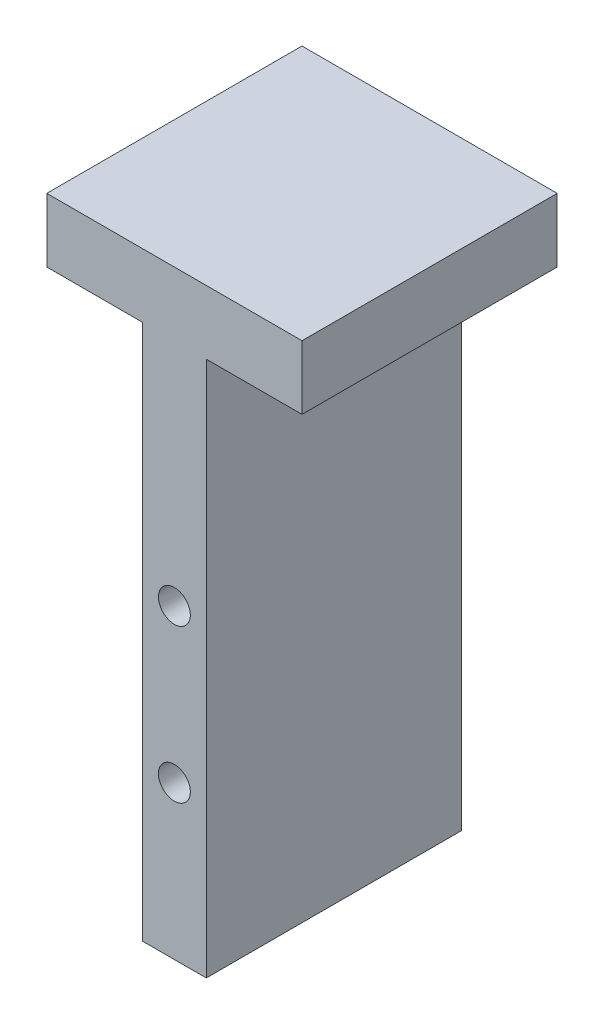
ISO-10303-21;
HEADER;
FILE_DESCRIPTION(('STEP AP214'),'2;1');
FILE_NAME('part.step','',(''),(''),'','','');
FILE_SCHEMA(('AUTOMOTIVE_DESIGN { 1 0 10303 214 1 1 1 1 }'));
ENDSEC;
DATA;
#1=APPLICATION_CONTEXT('core data for automotive mechanical design processes');
#2=APPLICATION_PROTOCOL_DEFINITION('international standard','automotive_design',2000,#1);
#3=PRODUCT_CONTEXT('',#1,'mechanical');
#4=PRODUCT('Part','Part','',(#3));
#5=PRODUCT_RELATED_PRODUCT_CATEGORY('part','',(#4));
#6=PRODUCT_DEFINITION_FORMATION('','',#4);
#7=PRODUCT_DEFINITION_CONTEXT('part definition',#1,'design');
#8=PRODUCT_DEFINITION('design','',#6,#7);
#9=PRODUCT_DEFINITION_SHAPE('','',#8);
#10=(LENGTH_UNIT() NAMED_UNIT(*) SI_UNIT(.MILLI.,.METRE.));
#11=(NAMED_UNIT(*) PLANE_ANGLE_UNIT() SI_UNIT($,.RADIAN.));
#12=(NAMED_UNIT(*) SI_UNIT($,.STERADIAN.) SOLID_ANGLE_UNIT());
#13=UNCERTAINTY_MEASURE_WITH_UNIT(LENGTH_MEASURE(1.E-05),#10,'distance_accuracy_value','');
#14=(GEOMETRIC_REPRESENTATION_CONTEXT(3) GLOBAL_UNCERTAINTY_ASSIGNED_CONTEXT((#13)) GLOBAL_UNIT_ASSIGNED_CONTEXT((#10,
#11,#12)) REPRESENTATION_CONTEXT('',''));
#15=CARTESIAN_POINT('',(0.,0.,0.));
#16=DIRECTION('',(0.,0.,1.));
#17=DIRECTION('',(1.,0.,0.));
#18=AXIS2_PLACEMENT_3D('',#15,#16,#17);
#19=CARTESIAN_POINT('',(0.,0.,0.));
#20=DIRECTION('',(0.,-1.,0.));
#21=DIRECTION('',(0.,0.,-1.));
#22=AXIS2_PLACEMENT_3D('',#19,#20,#21);
#23=PLANE('',#22);
#24=DIRECTION('',(0.,0.,1.));
#25=VECTOR('',#24,1.);
#26=CARTESIAN_POINT('',(2.5,0.,-10.));
#27=LINE('',#26,#25);
#28=CARTESIAN_POINT('',(2.5,0.,-10.));
#29=VERTEX_POINT('',#28);
#30=CARTESIAN_POINT('',(2.5,0.,10.));
#31=VERTEX_POINT('',#30);
#32=EDGE_CURVE('E66',#29,#31,#27,.T.);
#33=ORIENTED_EDGE('',*,*,#32,.F.);
#34=DIRECTION('',(-1.,0.,0.));
#35=VECTOR('',#34,1.);
#36=CARTESIAN_POINT('',(-10.,0.,-10.));
#37=LINE('',#36,#35);
#38=CARTESIAN_POINT('',(10.,0.,-10.));
#39=VERTEX_POINT('',#38);
#40=EDGE_CURVE('E202',#39,#29,#37,.T.);
#41=ORIENTED_EDGE('',*,*,#40,.F.);
#42=DIRECTION('',(0.,0.,-1.));
#43=VECTOR('',#42,1.);
#44=CARTESIAN_POINT('',(10.,0.,10.));
#45=LINE('',#44,#43);
#46=CARTESIAN_POINT('',(10.,0.,10.));
#47=VERTEX_POINT('',#46);
#48=EDGE_CURVE('E133',#47,#39,#45,.T.);
#49=ORIENTED_EDGE('',*,*,#48,.F.);
#50=DIRECTION('',(1.,0.,0.));
#51=VECTOR('',#50,1.);
#52=CARTESIAN_POINT('',(-10.,0.,10.));
#53=LINE('',#52,#51);
#54=EDGE_CURVE('E71',#31,#47,#53,.T.);
#55=ORIENTED_EDGE('',*,*,#54,.F.);
#56=EDGE_LOOP('',(#33,#41,#49,#55));
#57=FACE_BOUND('',#56,.T.);
#58=ADVANCED_FACE('F51',(#57),#23,.T.);
#59=CARTESIAN_POINT('',(10.,5.,10.));
#60=DIRECTION('',(-1.,0.,0.));
#61=DIRECTION('',(0.,0.,1.));
#62=AXIS2_PLACEMENT_3D('',#59,#60,#61);
#63=PLANE('',#62);
#64=ORIENTED_EDGE('',*,*,#48,.T.);
#65=DIRECTION('',(0.,-1.,0.));
#66=VECTOR('',#65,1.);
#67=CARTESIAN_POINT('',(10.,5.,-10.));
#68=LINE('',#67,#66);
#69=CARTESIAN_POINT('',(10.,5.,-10.));
#70=VERTEX_POINT('',#69);
#71=EDGE_CURVE('E13',#70,#39,#68,.T.);
#72=ORIENTED_EDGE('',*,*,#71,.F.);
#73=DIRECTION('',(0.,0.,-1.));
#74=VECTOR('',#73,1.);
#75=CARTESIAN_POINT('',(10.,5.,10.));
#76=LINE('',#75,#74);
#77=CARTESIAN_POINT('',(10.,5.,10.));
#78=VERTEX_POINT('',#77);
#79=EDGE_CURVE('E188',#78,#70,#76,.T.);
#80=ORIENTED_EDGE('',*,*,#79,.F.);
#81=DIRECTION('',(0.,-1.,0.));
#82=VECTOR('',#81,1.);
#83=CARTESIAN_POINT('',(10.,5.,10.));
#84=LINE('',#83,#82);
#85=EDGE_CURVE('E198',#78,#47,#84,.T.);
#86=ORIENTED_EDGE('',*,*,#85,.T.);
#87=EDGE_LOOP('',(#64,#72,#80,#86));
#88=FACE_BOUND('',#87,.T.);
#89=ADVANCED_FACE('F53',(#88),#63,.F.);
#90=CARTESIAN_POINT('',(-10.,5.,-10.));
#91=DIRECTION('',(0.,0.,1.));
#92=DIRECTION('',(1.,0.,0.));
#93=AXIS2_PLACEMENT_3D('',#90,#91,#92);
#94=PLANE('',#93);
#95=CARTESIAN_POINT('',(0.,-18.,-10.));
#96=DIRECTION('',(0.,0.,-1.));
#97=DIRECTION('',(-1.,0.,0.));
#98=AXIS2_PLACEMENT_3D('',#95,#96,#97);
#99=CIRCLE('',#98,1.24999999999999);
#100=CARTESIAN_POINT('',(-1.24999999999999,-18.,-10.));
#101=VERTEX_POINT('',#100);
#102=EDGE_CURVE('E154',#101,#101,#99,.T.);
#103=ORIENTED_EDGE('',*,*,#102,.F.);
#104=EDGE_LOOP('',(#103));
#105=FACE_BOUND('',#104,.T.);
#106=CARTESIAN_POINT('',(0.,-30.,-10.));
#107=DIRECTION('',(0.,0.,-1.));
#108=DIRECTION('',(-1.,0.,0.));
#109=AXIS2_PLACEMENT_3D('',#106,#107,#108);
#110=CIRCLE('',#109,1.24999999999999);
#111=CARTESIAN_POINT('',(-1.24999999999999,-30.,-10.));
#112=VERTEX_POINT('',#111);
#113=EDGE_CURVE('E160',#112,#112,#110,.T.);
#114=ORIENTED_EDGE('',*,*,#113,.F.);
#115=EDGE_LOOP('',(#114));
#116=FACE_BOUND('',#115,.T.);
#117=ORIENTED_EDGE('',*,*,#40,.T.);
#118=DIRECTION('',(0.,1.,0.));
#119=VECTOR('',#118,1.);
#120=CARTESIAN_POINT('',(2.5,-35.,-10.));
#121=LINE('',#120,#119);
#122=CARTESIAN_POINT('',(2.5,-42.,-10.));
#123=VERTEX_POINT('',#122);
#124=EDGE_CURVE('E182',#123,#29,#121,.T.);
#125=ORIENTED_EDGE('',*,*,#124,.F.);
#126=DIRECTION('',(1.,0.,0.));
#127=VECTOR('',#126,1.);
#128=CARTESIAN_POINT('',(2.5,-42.,-10.));
#129=LINE('',#128,#127);
#130=CARTESIAN_POINT('',(-2.5,-42.,-10.));
#131=VERTEX_POINT('',#130);
#132=EDGE_CURVE('E149',#131,#123,#129,.T.);
#133=ORIENTED_EDGE('',*,*,#132,.F.);
#134=DIRECTION('',(0.,1.,0.));
#135=VECTOR('',#134,1.);
#136=CARTESIAN_POINT('',(-2.5,-35.,-10.));
#137=LINE('',#136,#135);
#138=CARTESIAN_POINT('',(-2.5,0.,-10.));
#139=VERTEX_POINT('',#138);
#140=EDGE_CURVE('E184',#131,#139,#137,.T.);
#141=ORIENTED_EDGE('',*,*,#140,.T.);
#142=CARTESIAN_POINT('',(-10.,0.,-10.));
#143=VERTEX_POINT('',#142);
#144=EDGE_CURVE('E201',#139,#143,#37,.T.);
#145=ORIENTED_EDGE('',*,*,#144,.T.);
#146=DIRECTION('',(0.,-1.,0.));
#147=VECTOR('',#146,1.);
#148=CARTESIAN_POINT('',(-10.,5.,-10.));
#149=LINE('',#148,#147);
#150=CARTESIAN_POINT('',(-10.,5.,-10.));
#151=VERTEX_POINT('',#150);
#152=EDGE_CURVE('E59',#151,#143,#149,.T.);
#153=ORIENTED_EDGE('',*,*,#152,.F.);
#154=DIRECTION('',(-1.,0.,0.));
#155=VECTOR('',#154,1.);
#156=CARTESIAN_POINT('',(-10.,5.,-10.));
#157=LINE('',#156,#155);
#158=EDGE_CURVE('E191',#70,#151,#157,.T.);
#159=ORIENTED_EDGE('',*,*,#158,.F.);
#160=ORIENTED_EDGE('',*,*,#71,.T.);
#161=EDGE_LOOP('',(#117,#125,#133,#141,#145,#153,#159,#160));
#162=FACE_BOUND('',#161,.T.);
#163=ADVANCED_FACE('F225',(#105,#116,#162),#94,.F.);
#164=CARTESIAN_POINT('',(-10.,5.,10.));
#165=DIRECTION('',(1.,0.,0.));
#166=DIRECTION('',(0.,0.,-1.));
#167=AXIS2_PLACEMENT_3D('',#164,#165,#166);
#168=PLANE('',#167);
#169=DIRECTION('',(0.,0.,1.));
#170=VECTOR('',#169,1.);
#171=CARTESIAN_POINT('',(-10.,0.,10.));
#172=LINE('',#171,#170);
#173=CARTESIAN_POINT('',(-10.,0.,10.));
#174=VERTEX_POINT('',#173);
#175=EDGE_CURVE('E204',#143,#174,#172,.T.);
#176=ORIENTED_EDGE('',*,*,#175,.T.);
#177=DIRECTION('',(0.,-1.,0.));
#178=VECTOR('',#177,1.);
#179=CARTESIAN_POINT('',(-10.,5.,10.));
#180=LINE('',#179,#178);
#181=CARTESIAN_POINT('',(-10.,5.,10.));
#182=VERTEX_POINT('',#181);
#183=EDGE_CURVE('E209',#182,#174,#180,.T.);
#184=ORIENTED_EDGE('',*,*,#183,.F.);
#185=DIRECTION('',(0.,0.,1.));
#186=VECTOR('',#185,1.);
#187=CARTESIAN_POINT('',(-10.,5.,10.));
#188=LINE('',#187,#186);
#189=EDGE_CURVE('E194',#151,#182,#188,.T.);
#190=ORIENTED_EDGE('',*,*,#189,.F.);
#191=ORIENTED_EDGE('',*,*,#152,.T.);
#192=EDGE_LOOP('',(#176,#184,#190,#191));
#193=FACE_BOUND('',#192,.T.);
#194=ADVANCED_FACE('F216',(#193),#168,.F.);
#195=CARTESIAN_POINT('',(-10.,5.,10.));
#196=DIRECTION('',(0.,0.,-1.));
#197=DIRECTION('',(-1.,0.,0.));
#198=AXIS2_PLACEMENT_3D('',#195,#196,#197);
#199=PLANE('',#198);
#200=CARTESIAN_POINT('',(0.,-18.,10.));
#201=DIRECTION('',(0.,0.,1.));
#202=DIRECTION('',(1.,0.,0.));
#203=AXIS2_PLACEMENT_3D('',#200,#201,#202);
#204=CIRCLE('',#203,1.24999999999999);
#205=CARTESIAN_POINT('',(1.24999999999999,-18.,10.));
#206=VERTEX_POINT('',#205);
#207=EDGE_CURVE('E166',#206,#206,#204,.T.);
#208=ORIENTED_EDGE('',*,*,#207,.F.);
#209=EDGE_LOOP('',(#208));
#210=FACE_BOUND('',#209,.T.);
#211=CARTESIAN_POINT('',(0.,-30.,10.));
#212=DIRECTION('',(0.,0.,1.));
#213=DIRECTION('',(1.,0.,0.));
#214=AXIS2_PLACEMENT_3D('',#211,#212,#213);
#215=CIRCLE('',#214,1.24999999999999);
#216=CARTESIAN_POINT('',(1.24999999999999,-30.,10.));
#217=VERTEX_POINT('',#216);
#218=EDGE_CURVE('E172',#217,#217,#215,.T.);
#219=ORIENTED_EDGE('',*,*,#218,.F.);
#220=EDGE_LOOP('',(#219));
#221=FACE_BOUND('',#220,.T.);
#222=CARTESIAN_POINT('',(-2.5,0.,10.));
#223=VERTEX_POINT('',#222);
#224=EDGE_CURVE('E192',#174,#223,#53,.T.);
#225=ORIENTED_EDGE('',*,*,#224,.T.);
#226=DIRECTION('',(0.,1.,0.));
#227=VECTOR('',#226,1.);
#228=CARTESIAN_POINT('',(-2.5,-35.,10.));
#229=LINE('',#228,#227);
#230=CARTESIAN_POINT('',(-2.5,-42.,10.));
#231=VERTEX_POINT('',#230);
#232=EDGE_CURVE('E134',#231,#223,#229,.T.);
#233=ORIENTED_EDGE('',*,*,#232,.F.);
#234=DIRECTION('',(-1.,0.,0.));
#235=VECTOR('',#234,1.);
#236=CARTESIAN_POINT('',(2.5,-42.,10.));
#237=LINE('',#236,#235);
#238=CARTESIAN_POINT('',(2.5,-42.,10.));
#239=VERTEX_POINT('',#238);
#240=EDGE_CURVE('E137',#239,#231,#237,.T.);
#241=ORIENTED_EDGE('',*,*,#240,.F.);
#242=DIRECTION('',(0.,1.,0.));
#243=VECTOR('',#242,1.);
#244=CARTESIAN_POINT('',(2.5,-35.,10.));
#245=LINE('',#244,#243);
#246=EDGE_CURVE('E126',#239,#31,#245,.T.);
#247=ORIENTED_EDGE('',*,*,#246,.T.);
#248=ORIENTED_EDGE('',*,*,#54,.T.);
#249=ORIENTED_EDGE('',*,*,#85,.F.);
#250=DIRECTION('',(1.,0.,0.));
#251=VECTOR('',#250,1.);
#252=CARTESIAN_POINT('',(-10.,5.,10.));
#253=LINE('',#252,#251);
#254=EDGE_CURVE('E196',#182,#78,#253,.T.);
#255=ORIENTED_EDGE('',*,*,#254,.F.);
#256=ORIENTED_EDGE('',*,*,#183,.T.);
#257=EDGE_LOOP('',(#225,#233,#241,#247,#248,#249,#255,#256));
#258=FACE_BOUND('',#257,.T.);
#259=ADVANCED_FACE('F139',(#210,#221,#258),#199,.F.);
#260=CARTESIAN_POINT('',(0.,5.,0.));
#261=DIRECTION('',(0.,-1.,0.));
#262=DIRECTION('',(0.,0.,-1.));
#263=AXIS2_PLACEMENT_3D('',#260,#261,#262);
#264=PLANE('',#263);
#265=ORIENTED_EDGE('',*,*,#79,.T.);
#266=ORIENTED_EDGE('',*,*,#158,.T.);
#267=ORIENTED_EDGE('',*,*,#189,.T.);
#268=ORIENTED_EDGE('',*,*,#254,.T.);
#269=EDGE_LOOP('',(#265,#266,#267,#268));
#270=FACE_BOUND('',#269,.T.);
#271=ADVANCED_FACE('F231',(#270),#264,.F.);
#272=DIRECTION('',(0.,0.,-1.));
#273=VECTOR('',#272,1.);
#274=CARTESIAN_POINT('',(-2.5,0.,-10.));
#275=LINE('',#274,#273);
#276=EDGE_CURVE('E179',#223,#139,#275,.T.);
#277=ORIENTED_EDGE('',*,*,#276,.F.);
#278=ORIENTED_EDGE('',*,*,#224,.F.);
#279=ORIENTED_EDGE('',*,*,#175,.F.);
#280=ORIENTED_EDGE('',*,*,#144,.F.);
#281=EDGE_LOOP('',(#277,#278,#279,#280));
#282=FACE_BOUND('',#281,.T.);
#283=ADVANCED_FACE('F221',(#282),#23,.T.);
#284=CARTESIAN_POINT('',(2.5,-35.,-10.));
#285=DIRECTION('',(-1.,0.,0.));
#286=DIRECTION('',(0.,0.,1.));
#287=AXIS2_PLACEMENT_3D('',#284,#285,#286);
#288=PLANE('',#287);
#289=ORIENTED_EDGE('',*,*,#32,.T.);
#290=ORIENTED_EDGE('',*,*,#246,.F.);
#291=DIRECTION('',(0.,0.,1.));
#292=VECTOR('',#291,1.);
#293=CARTESIAN_POINT('',(2.5,-42.,-10.));
#294=LINE('',#293,#292);
#295=EDGE_CURVE('E131',#123,#239,#294,.T.);
#296=ORIENTED_EDGE('',*,*,#295,.F.);
#297=ORIENTED_EDGE('',*,*,#124,.T.);
#298=EDGE_LOOP('',(#289,#290,#296,#297));
#299=FACE_BOUND('',#298,.T.);
#300=ADVANCED_FACE('F128',(#299),#288,.F.);
#301=CARTESIAN_POINT('',(-2.5,-35.,-10.));
#302=DIRECTION('',(1.,0.,0.));
#303=DIRECTION('',(0.,0.,-1.));
#304=AXIS2_PLACEMENT_3D('',#301,#302,#303);
#305=PLANE('',#304);
#306=ORIENTED_EDGE('',*,*,#276,.T.);
#307=ORIENTED_EDGE('',*,*,#140,.F.);
#308=DIRECTION('',(0.,0.,-1.));
#309=VECTOR('',#308,1.);
#310=CARTESIAN_POINT('',(-2.5,-42.,-10.));
#311=LINE('',#310,#309);
#312=EDGE_CURVE('E144',#231,#131,#311,.T.);
#313=ORIENTED_EDGE('',*,*,#312,.F.);
#314=ORIENTED_EDGE('',*,*,#232,.T.);
#315=EDGE_LOOP('',(#306,#307,#313,#314));
#316=FACE_BOUND('',#315,.T.);
#317=ADVANCED_FACE('F224',(#316),#305,.F.);
#318=CARTESIAN_POINT('',(0.,-30.,3.49999999999999));
#319=DIRECTION('',(0.,0.,1.));
#320=DIRECTION('',(1.,0.,0.));
#321=AXIS2_PLACEMENT_3D('',#318,#319,#320);
#322=CONICAL_SURFACE('',#321,1.24999999999999,1.02974425867665);
#323=CARTESIAN_POINT('',(0.,-30.,2.74892422621555));
#324=VERTEX_POINT('',#323);
#325=VERTEX_LOOP('',#324);
#326=FACE_BOUND('',#325,.T.);
#327=CARTESIAN_POINT('',(0.,-30.,3.49999999999999));
#328=DIRECTION('',(0.,0.,1.));
#329=DIRECTION('',(1.,0.,0.));
#330=AXIS2_PLACEMENT_3D('',#327,#328,#329);
#331=CIRCLE('',#330,1.24999999999999);
#332=CARTESIAN_POINT('',(1.24999999999999,-30.,3.49999999999999));
#333=VERTEX_POINT('',#332);
#334=EDGE_CURVE('E175',#333,#333,#331,.T.);
#335=ORIENTED_EDGE('',*,*,#334,.T.);
#336=EDGE_LOOP('',(#335));
#337=FACE_BOUND('',#336,.T.);
#338=ADVANCED_FACE('F285',(#326,#337),#322,.F.);
#339=CARTESIAN_POINT('',(0.,-30.,10.));
#340=DIRECTION('',(0.,0.,1.));
#341=DIRECTION('',(1.,0.,0.));
#342=AXIS2_PLACEMENT_3D('',#339,#340,#341);
#343=CYLINDRICAL_SURFACE('',#342,1.24999999999999);
#344=ORIENTED_EDGE('',*,*,#334,.F.);
#345=EDGE_LOOP('',(#344));
#346=FACE_BOUND('',#345,.T.);
#347=ORIENTED_EDGE('',*,*,#218,.T.);
#348=EDGE_LOOP('',(#347));
#349=FACE_BOUND('',#348,.T.);
#350=ADVANCED_FACE('F281',(#346,#349),#343,.F.);
#351=CARTESIAN_POINT('',(0.,-18.,3.49999999999999));
#352=DIRECTION('',(0.,0.,1.));
#353=DIRECTION('',(1.,0.,0.));
#354=AXIS2_PLACEMENT_3D('',#351,#352,#353);
#355=CONICAL_SURFACE('',#354,1.24999999999999,1.02974425867665);
#356=CARTESIAN_POINT('',(0.,-18.,2.74892422621555));
#357=VERTEX_POINT('',#356);
#358=VERTEX_LOOP('',#357);
#359=FACE_BOUND('',#358,.T.);
#360=CARTESIAN_POINT('',(0.,-18.,3.49999999999999));
#361=DIRECTION('',(0.,0.,1.));
#362=DIRECTION('',(1.,0.,0.));
#363=AXIS2_PLACEMENT_3D('',#360,#361,#362);
#364=CIRCLE('',#363,1.24999999999999);
#365=CARTESIAN_POINT('',(1.24999999999999,-18.,3.49999999999999));
#366=VERTEX_POINT('',#365);
#367=EDGE_CURVE('E169',#366,#366,#364,.T.);
#368=ORIENTED_EDGE('',*,*,#367,.T.);
#369=EDGE_LOOP('',(#368));
#370=FACE_BOUND('',#369,.T.);
#371=ADVANCED_FACE('F277',(#359,#370),#355,.F.);
#372=CARTESIAN_POINT('',(0.,-18.,10.));
#373=DIRECTION('',(0.,0.,1.));
#374=DIRECTION('',(1.,0.,0.));
#375=AXIS2_PLACEMENT_3D('',#372,#373,#374);
#376=CYLINDRICAL_SURFACE('',#375,1.24999999999999);
#377=ORIENTED_EDGE('',*,*,#367,.F.);
#378=EDGE_LOOP('',(#377));
#379=FACE_BOUND('',#378,.T.);
#380=ORIENTED_EDGE('',*,*,#207,.T.);
#381=EDGE_LOOP('',(#380));
#382=FACE_BOUND('',#381,.T.);
#383=ADVANCED_FACE('F269',(#379,#382),#376,.F.);
#384=CARTESIAN_POINT('',(0.,-30.,-3.49999999999999));
#385=DIRECTION('',(0.,0.,-1.));
#386=DIRECTION('',(-1.,0.,0.));
#387=AXIS2_PLACEMENT_3D('',#384,#385,#386);
#388=CONICAL_SURFACE('',#387,1.24999999999999,1.02974425867665);
#389=CARTESIAN_POINT('',(0.,-30.,-2.74892422621555));
#390=VERTEX_POINT('',#389);
#391=VERTEX_LOOP('',#390);
#392=FACE_BOUND('',#391,.T.);
#393=CARTESIAN_POINT('',(0.,-30.,-3.49999999999999));
#394=DIRECTION('',(0.,0.,-1.));
#395=DIRECTION('',(-1.,0.,0.));
#396=AXIS2_PLACEMENT_3D('',#393,#394,#395);
#397=CIRCLE('',#396,1.24999999999999);
#398=CARTESIAN_POINT('',(-1.24999999999999,-30.,-3.49999999999999));
#399=VERTEX_POINT('',#398);
#400=EDGE_CURVE('E163',#399,#399,#397,.T.);
#401=ORIENTED_EDGE('',*,*,#400,.T.);
#402=EDGE_LOOP('',(#401));
#403=FACE_BOUND('',#402,.T.);
#404=ADVANCED_FACE('F259',(#392,#403),#388,.F.);
#405=CARTESIAN_POINT('',(0.,-30.,-10.));
#406=DIRECTION('',(0.,0.,-1.));
#407=DIRECTION('',(-1.,0.,0.));
#408=AXIS2_PLACEMENT_3D('',#405,#406,#407);
#409=CYLINDRICAL_SURFACE('',#408,1.24999999999999);
#410=ORIENTED_EDGE('',*,*,#400,.F.);
#411=EDGE_LOOP('',(#410));
#412=FACE_BOUND('',#411,.T.);
#413=ORIENTED_EDGE('',*,*,#113,.T.);
#414=EDGE_LOOP('',(#413));
#415=FACE_BOUND('',#414,.T.);
#416=ADVANCED_FACE('F256',(#412,#415),#409,.F.);
#417=CARTESIAN_POINT('',(0.,-18.,-3.49999999999999));
#418=DIRECTION('',(0.,0.,-1.));
#419=DIRECTION('',(-1.,0.,0.));
#420=AXIS2_PLACEMENT_3D('',#417,#418,#419);
#421=CONICAL_SURFACE('',#420,1.24999999999999,1.02974425867665);
#422=CARTESIAN_POINT('',(0.,-18.,-2.74892422621555));
#423=VERTEX_POINT('',#422);
#424=VERTEX_LOOP('',#423);
#425=FACE_BOUND('',#424,.T.);
#426=CARTESIAN_POINT('',(0.,-18.,-3.49999999999999));
#427=DIRECTION('',(0.,0.,-1.));
#428=DIRECTION('',(-1.,0.,0.));
#429=AXIS2_PLACEMENT_3D('',#426,#427,#428);
#430=CIRCLE('',#429,1.24999999999999);
#431=CARTESIAN_POINT('',(-1.24999999999999,-18.,-3.49999999999999));
#432=VERTEX_POINT('',#431);
#433=EDGE_CURVE('E157',#432,#432,#430,.T.);
#434=ORIENTED_EDGE('',*,*,#433,.T.);
#435=EDGE_LOOP('',(#434));
#436=FACE_BOUND('',#435,.T.);
#437=ADVANCED_FACE('F258',(#425,#436),#421,.F.);
#438=CARTESIAN_POINT('',(0.,-18.,-10.));
#439=DIRECTION('',(0.,0.,-1.));
#440=DIRECTION('',(-1.,0.,0.));
#441=AXIS2_PLACEMENT_3D('',#438,#439,#440);
#442=CYLINDRICAL_SURFACE('',#441,1.24999999999999);
#443=ORIENTED_EDGE('',*,*,#433,.F.);
#444=EDGE_LOOP('',(#443));
#445=FACE_BOUND('',#444,.T.);
#446=ORIENTED_EDGE('',*,*,#102,.T.);
#447=EDGE_LOOP('',(#446));
#448=FACE_BOUND('',#447,.T.);
#449=ADVANCED_FACE('F266',(#445,#448),#442,.F.);
#450=CARTESIAN_POINT('',(0.,-42.,0.));
#451=DIRECTION('',(0.,-1.,0.));
#452=DIRECTION('',(0.,0.,-1.));
#453=AXIS2_PLACEMENT_3D('',#450,#451,#452);
#454=PLANE('',#453);
#455=ORIENTED_EDGE('',*,*,#295,.T.);
#456=ORIENTED_EDGE('',*,*,#240,.T.);
#457=ORIENTED_EDGE('',*,*,#312,.T.);
#458=ORIENTED_EDGE('',*,*,#132,.T.);
#459=EDGE_LOOP('',(#455,#456,#457,#458));
#460=FACE_BOUND('',#459,.T.);
#461=ADVANCED_FACE('F147',(#460),#454,.T.);
#462=CLOSED_SHELL('',(#58,#89,#163,#194,#259,#271,#283,#300,#317,#338,#350,#371,#383,#404,#416,
#437,#449,#461));
#463=MANIFOLD_SOLID_BREP('B2',#462);
#464=ADVANCED_BREP_SHAPE_REPRESENTATION('',(#18,#463),#14);
#465=SHAPE_DEFINITION_REPRESENTATION(#9,#464);
ENDSEC;
END-ISO-10303-21;
